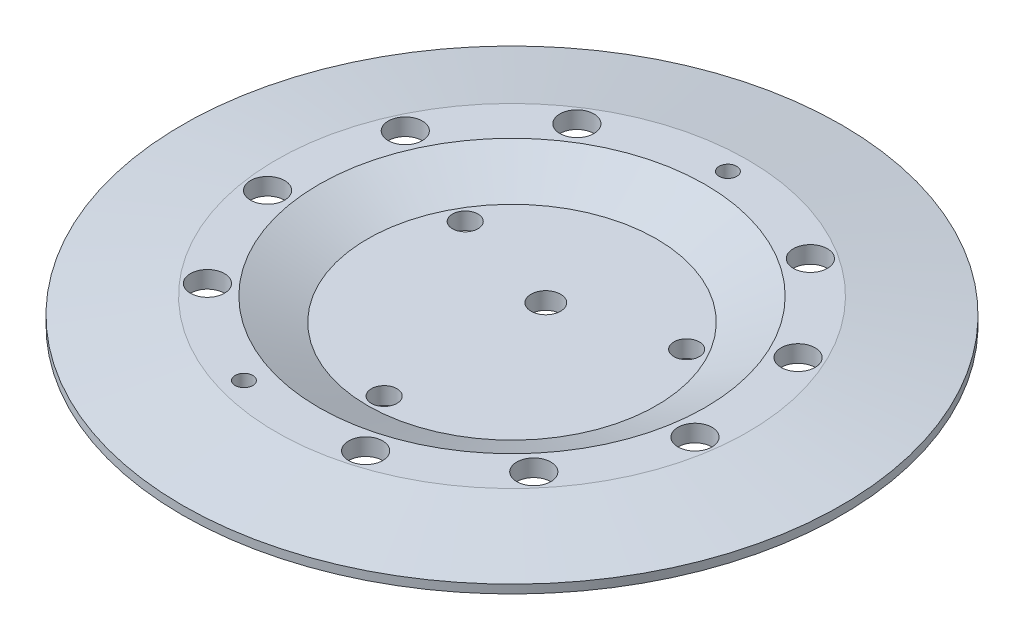
ISO-10303-21;
HEADER;
FILE_DESCRIPTION(('STEP AP214'),'2;1');
FILE_NAME('part.step','',(''),(''),'','','');
FILE_SCHEMA(('AUTOMOTIVE_DESIGN { 1 0 10303 214 1 1 1 1 }'));
ENDSEC;
DATA;
#1=APPLICATION_CONTEXT('core data for automotive mechanical design processes');
#2=APPLICATION_PROTOCOL_DEFINITION('international standard','automotive_design',2000,#1);
#3=PRODUCT_CONTEXT('',#1,'mechanical');
#4=PRODUCT('Part','Part','',(#3));
#5=PRODUCT_RELATED_PRODUCT_CATEGORY('part','',(#4));
#6=PRODUCT_DEFINITION_FORMATION('','',#4);
#7=PRODUCT_DEFINITION_CONTEXT('part definition',#1,'design');
#8=PRODUCT_DEFINITION('design','',#6,#7);
#9=PRODUCT_DEFINITION_SHAPE('','',#8);
#10=(LENGTH_UNIT() NAMED_UNIT(*) SI_UNIT(.MILLI.,.METRE.));
#11=(NAMED_UNIT(*) PLANE_ANGLE_UNIT() SI_UNIT($,.RADIAN.));
#12=(NAMED_UNIT(*) SI_UNIT($,.STERADIAN.) SOLID_ANGLE_UNIT());
#13=UNCERTAINTY_MEASURE_WITH_UNIT(LENGTH_MEASURE(1.E-05),#10,'distance_accuracy_value','');
#14=(GEOMETRIC_REPRESENTATION_CONTEXT(3) GLOBAL_UNCERTAINTY_ASSIGNED_CONTEXT((#13)) GLOBAL_UNIT_ASSIGNED_CONTEXT((#10,
#11,#12)) REPRESENTATION_CONTEXT('',''));
#15=CARTESIAN_POINT('',(0.,0.,0.));
#16=DIRECTION('',(0.,0.,1.));
#17=DIRECTION('',(1.,0.,0.));
#18=AXIS2_PLACEMENT_3D('',#15,#16,#17);
#19=CARTESIAN_POINT('',(0.,1.44153815363196,0.));
#20=DIRECTION('',(0.,1.,0.));
#21=DIRECTION('',(0.,0.,1.));
#22=AXIS2_PLACEMENT_3D('',#19,#20,#21);
#23=CONICAL_SURFACE('',#22,56.0097581554932,1.0471975511966);
#24=CARTESIAN_POINT('',(0.,2.59060481831044,0.));
#25=DIRECTION('',(0.,-1.,0.));
#26=DIRECTION('',(0.,0.,-1.));
#27=AXIS2_PLACEMENT_3D('',#24,#25,#26);
#28=CIRCLE('',#27,58.);
#29=CARTESIAN_POINT('',(0.,2.59060481831044,-58.));
#30=VERTEX_POINT('',#29);
#31=EDGE_CURVE('E142',#30,#30,#28,.T.);
#32=ORIENTED_EDGE('',*,*,#31,.T.);
#33=EDGE_LOOP('',(#32));
#34=FACE_BOUND('',#33,.T.);
#35=CARTESIAN_POINT('',(0.,1.44153815363196,0.));
#36=DIRECTION('',(0.,-1.,0.));
#37=DIRECTION('',(0.,0.,-1.));
#38=AXIS2_PLACEMENT_3D('',#35,#36,#37);
#39=CIRCLE('',#38,56.0097581554932);
#40=CARTESIAN_POINT('',(0.,1.44153815363196,-56.0097581554932));
#41=VERTEX_POINT('',#40);
#42=EDGE_CURVE('E10',#41,#41,#39,.T.);
#43=ORIENTED_EDGE('',*,*,#42,.F.);
#44=EDGE_LOOP('',(#43));
#45=FACE_BOUND('',#44,.T.);
#46=ADVANCED_FACE('F43',(#34,#45),#23,.T.);
#47=CARTESIAN_POINT('',(0.,4.,0.));
#48=DIRECTION('',(0.,-1.,0.));
#49=DIRECTION('',(0.,0.,-1.));
#50=AXIS2_PLACEMENT_3D('',#47,#48,#49);
#51=CONICAL_SURFACE('',#50,41.5,1.39626340159547);
#52=ORIENTED_EDGE('',*,*,#42,.T.);
#53=EDGE_LOOP('',(#52));
#54=FACE_BOUND('',#53,.T.);
#55=CARTESIAN_POINT('',(0.,4.,0.));
#56=DIRECTION('',(0.,-1.,0.));
#57=DIRECTION('',(0.,0.,-1.));
#58=AXIS2_PLACEMENT_3D('',#55,#56,#57);
#59=CIRCLE('',#58,41.5);
#60=CARTESIAN_POINT('',(0.,4.,-41.5));
#61=VERTEX_POINT('',#60);
#62=EDGE_CURVE('E51',#61,#61,#59,.T.);
#63=ORIENTED_EDGE('',*,*,#62,.F.);
#64=EDGE_LOOP('',(#63));
#65=FACE_BOUND('',#64,.T.);
#66=ADVANCED_FACE('F174',(#54,#65),#51,.F.);
#67=CARTESIAN_POINT('',(34.,4.,0.));
#68=DIRECTION('',(0.,-1.,0.));
#69=DIRECTION('',(0.,0.,-1.));
#70=AXIS2_PLACEMENT_3D('',#67,#68,#69);
#71=PLANE('',#70);
#72=CARTESIAN_POINT('',(10.7058371599743,4.,36.4607329973509));
#73=DIRECTION('',(0.,-1.,0.));
#74=DIRECTION('',(1.,0.,0.));
#75=AXIS2_PLACEMENT_3D('',#72,#73,#74);
#76=CIRCLE('',#75,3.);
#77=CARTESIAN_POINT('',(13.7058371599743,4.,36.4607329973509));
#78=VERTEX_POINT('',#77);
#79=EDGE_CURVE('E95',#78,#78,#76,.T.);
#80=ORIENTED_EDGE('',*,*,#79,.F.);
#81=EDGE_LOOP('',(#80));
#82=FACE_BOUND('',#81,.T.);
#83=CARTESIAN_POINT('',(-37.6132147914754,4.,5.40796385438484));
#84=DIRECTION('',(0.,-1.,0.));
#85=DIRECTION('',(1.,0.,0.));
#86=AXIS2_PLACEMENT_3D('',#83,#84,#85);
#87=CIRCLE('',#86,3.);
#88=CARTESIAN_POINT('',(-34.6132147914754,4.,5.40796385438484));
#89=VERTEX_POINT('',#88);
#90=EDGE_CURVE('E76',#89,#89,#87,.T.);
#91=ORIENTED_EDGE('',*,*,#90,.F.);
#92=EDGE_LOOP('',(#91));
#93=FACE_BOUND('',#92,.T.);
#94=CARTESIAN_POINT('',(34.5660158234717,4.,-15.7857704940717));
#95=DIRECTION('',(0.,-1.,0.));
#96=DIRECTION('',(1.,0.,0.));
#97=AXIS2_PLACEMENT_3D('',#94,#95,#96);
#98=CIRCLE('',#97,3.);
#99=CARTESIAN_POINT('',(37.5660158234717,4.,-15.7857704940717));
#100=VERTEX_POINT('',#99);
#101=EDGE_CURVE('E87',#100,#100,#98,.T.);
#102=ORIENTED_EDGE('',*,*,#101,.F.);
#103=EDGE_LOOP('',(#102));
#104=FACE_BOUND('',#103,.T.);
#105=CARTESIAN_POINT('',(20.5443510633127,4.,-31.9676342475849));
#106=DIRECTION('',(0.,-1.,0.));
#107=DIRECTION('',(1.,0.,0.));
#108=AXIS2_PLACEMENT_3D('',#105,#106,#107);
#109=CIRCLE('',#108,3.);
#110=CARTESIAN_POINT('',(23.5443510633127,4.,-31.9676342475849));
#111=VERTEX_POINT('',#110);
#112=EDGE_CURVE('E269',#111,#111,#109,.T.);
#113=ORIENTED_EDGE('',*,*,#112,.F.);
#114=EDGE_LOOP('',(#113));
#115=FACE_BOUND('',#114,.T.);
#116=CARTESIAN_POINT('',(-20.5443510633127,4.,-31.9676342475849));
#117=DIRECTION('',(0.,-1.,0.));
#118=DIRECTION('',(1.,0.,0.));
#119=AXIS2_PLACEMENT_3D('',#116,#117,#118);
#120=CIRCLE('',#119,3.);
#121=CARTESIAN_POINT('',(-17.5443510633127,4.,-31.9676342475849));
#122=VERTEX_POINT('',#121);
#123=EDGE_CURVE('E261',#122,#122,#120,.T.);
#124=ORIENTED_EDGE('',*,*,#123,.F.);
#125=EDGE_LOOP('',(#124));
#126=FACE_BOUND('',#125,.T.);
#127=CARTESIAN_POINT('',(-34.5660158234717,4.,-15.7857704940717));
#128=DIRECTION('',(0.,-1.,0.));
#129=DIRECTION('',(1.,0.,0.));
#130=AXIS2_PLACEMENT_3D('',#127,#128,#129);
#131=CIRCLE('',#130,3.);
#132=CARTESIAN_POINT('',(-31.5660158234717,4.,-15.7857704940717));
#133=VERTEX_POINT('',#132);
#134=EDGE_CURVE('E120',#133,#133,#131,.T.);
#135=ORIENTED_EDGE('',*,*,#134,.F.);
#136=EDGE_LOOP('',(#135));
#137=FACE_BOUND('',#136,.T.);
#138=CARTESIAN_POINT('',(-28.7184838254618,4.,24.8847078899208));
#139=DIRECTION('',(0.,-1.,0.));
#140=DIRECTION('',(1.,0.,0.));
#141=AXIS2_PLACEMENT_3D('',#138,#139,#140);
#142=CIRCLE('',#141,3.);
#143=CARTESIAN_POINT('',(-25.7184838254618,4.,24.8847078899208));
#144=VERTEX_POINT('',#143);
#145=EDGE_CURVE('E112',#144,#144,#142,.T.);
#146=ORIENTED_EDGE('',*,*,#145,.F.);
#147=EDGE_LOOP('',(#146));
#148=FACE_BOUND('',#147,.T.);
#149=CARTESIAN_POINT('',(37.6132147914754,4.,5.40796385438483));
#150=DIRECTION('',(0.,-1.,0.));
#151=DIRECTION('',(1.,0.,0.));
#152=AXIS2_PLACEMENT_3D('',#149,#150,#151);
#153=CIRCLE('',#152,3.);
#154=CARTESIAN_POINT('',(40.6132147914754,4.,5.40796385438483));
#155=VERTEX_POINT('',#154);
#156=EDGE_CURVE('E104',#155,#155,#153,.T.);
#157=ORIENTED_EDGE('',*,*,#156,.F.);
#158=EDGE_LOOP('',(#157));
#159=FACE_BOUND('',#158,.T.);
#160=CARTESIAN_POINT('',(28.7184838254618,4.,24.8847078899208));
#161=DIRECTION('',(0.,-1.,0.));
#162=DIRECTION('',(1.,0.,0.));
#163=AXIS2_PLACEMENT_3D('',#160,#161,#162);
#164=CIRCLE('',#163,3.);
#165=CARTESIAN_POINT('',(31.7184838254618,4.,24.8847078899208));
#166=VERTEX_POINT('',#165);
#167=EDGE_CURVE('E96',#166,#166,#164,.T.);
#168=ORIENTED_EDGE('',*,*,#167,.F.);
#169=EDGE_LOOP('',(#168));
#170=FACE_BOUND('',#169,.T.);
#171=CARTESIAN_POINT('',(0.,4.,-38.));
#172=DIRECTION('',(0.,-1.,0.));
#173=DIRECTION('',(0.,0.,-1.));
#174=AXIS2_PLACEMENT_3D('',#171,#172,#173);
#175=CIRCLE('',#174,1.55);
#176=CARTESIAN_POINT('',(0.,4.,-39.55));
#177=VERTEX_POINT('',#176);
#178=EDGE_CURVE('E138',#177,#177,#175,.T.);
#179=ORIENTED_EDGE('',*,*,#178,.F.);
#180=EDGE_LOOP('',(#179));
#181=FACE_BOUND('',#180,.T.);
#182=CARTESIAN_POINT('',(-10.7058371599743,4.,36.4607329973509));
#183=DIRECTION('',(0.,-1.,0.));
#184=DIRECTION('',(0.,0.,-1.));
#185=AXIS2_PLACEMENT_3D('',#182,#183,#184);
#186=CIRCLE('',#185,1.55);
#187=CARTESIAN_POINT('',(-10.7058371599743,4.,34.9107329973509));
#188=VERTEX_POINT('',#187);
#189=EDGE_CURVE('E129',#188,#188,#186,.T.);
#190=ORIENTED_EDGE('',*,*,#189,.F.);
#191=EDGE_LOOP('',(#190));
#192=FACE_BOUND('',#191,.T.);
#193=ORIENTED_EDGE('',*,*,#62,.T.);
#194=EDGE_LOOP('',(#193));
#195=FACE_BOUND('',#194,.T.);
#196=CARTESIAN_POINT('',(0.,4.,0.));
#197=DIRECTION('',(0.,-1.,0.));
#198=DIRECTION('',(0.,0.,-1.));
#199=AXIS2_PLACEMENT_3D('',#196,#197,#198);
#200=CIRCLE('',#199,34.);
#201=CARTESIAN_POINT('',(0.,4.,-34.));
#202=VERTEX_POINT('',#201);
#203=EDGE_CURVE('E57',#202,#202,#200,.T.);
#204=ORIENTED_EDGE('',*,*,#203,.F.);
#205=EDGE_LOOP('',(#204));
#206=FACE_BOUND('',#205,.T.);
#207=ADVANCED_FACE('F172',(#82,#93,#104,#115,#126,#137,#148,#159,#170,#181,#192,#195,#206),#71,.T.);
#208=CARTESIAN_POINT('',(0.,0.,0.));
#209=DIRECTION('',(0.,1.,0.));
#210=DIRECTION('',(0.,0.,1.));
#211=AXIS2_PLACEMENT_3D('',#208,#209,#210);
#212=CONICAL_SURFACE('',#211,25.4219723179618,1.13446401379631);
#213=ORIENTED_EDGE('',*,*,#203,.T.);
#214=EDGE_LOOP('',(#213));
#215=FACE_BOUND('',#214,.T.);
#216=CARTESIAN_POINT('',(0.,0.,0.));
#217=DIRECTION('',(0.,-1.,0.));
#218=DIRECTION('',(0.,0.,-1.));
#219=AXIS2_PLACEMENT_3D('',#216,#217,#218);
#220=CIRCLE('',#219,25.4219723179618);
#221=CARTESIAN_POINT('',(0.,0.,-25.4219723179618));
#222=VERTEX_POINT('',#221);
#223=EDGE_CURVE('E162',#222,#222,#220,.T.);
#224=ORIENTED_EDGE('',*,*,#223,.F.);
#225=EDGE_LOOP('',(#224));
#226=FACE_BOUND('',#225,.T.);
#227=ADVANCED_FACE('F169',(#215,#226),#212,.T.);
#228=CARTESIAN_POINT('',(0.,0.,0.));
#229=DIRECTION('',(0.,-1.,0.));
#230=DIRECTION('',(0.,0.,-1.));
#231=AXIS2_PLACEMENT_3D('',#228,#229,#230);
#232=PLANE('',#231);
#233=CARTESIAN_POINT('',(19.4855715851499,0.,-11.25));
#234=DIRECTION('',(0.,-1.,0.));
#235=DIRECTION('',(1.,0.,0.));
#236=AXIS2_PLACEMENT_3D('',#233,#234,#235);
#237=CIRCLE('',#236,2.25);
#238=CARTESIAN_POINT('',(21.7355715851499,0.,-11.25));
#239=VERTEX_POINT('',#238);
#240=EDGE_CURVE('E66',#239,#239,#237,.T.);
#241=ORIENTED_EDGE('',*,*,#240,.F.);
#242=EDGE_LOOP('',(#241));
#243=FACE_BOUND('',#242,.T.);
#244=CARTESIAN_POINT('',(0.,0.,-5.95));
#245=DIRECTION('',(0.,-1.,0.));
#246=DIRECTION('',(1.,0.,0.));
#247=AXIS2_PLACEMENT_3D('',#244,#245,#246);
#248=CIRCLE('',#247,2.6);
#249=CARTESIAN_POINT('',(2.6,0.,-5.95));
#250=VERTEX_POINT('',#249);
#251=EDGE_CURVE('E233',#250,#250,#248,.T.);
#252=ORIENTED_EDGE('',*,*,#251,.F.);
#253=EDGE_LOOP('',(#252));
#254=FACE_BOUND('',#253,.T.);
#255=CARTESIAN_POINT('',(0.,0.,22.5));
#256=DIRECTION('',(0.,-1.,0.));
#257=DIRECTION('',(1.,0.,0.));
#258=AXIS2_PLACEMENT_3D('',#255,#256,#257);
#259=CIRCLE('',#258,2.25);
#260=CARTESIAN_POINT('',(2.24999999999999,0.,22.5));
#261=VERTEX_POINT('',#260);
#262=EDGE_CURVE('E237',#261,#261,#259,.T.);
#263=ORIENTED_EDGE('',*,*,#262,.F.);
#264=EDGE_LOOP('',(#263));
#265=FACE_BOUND('',#264,.T.);
#266=CARTESIAN_POINT('',(-19.4855715851499,0.,-11.25));
#267=DIRECTION('',(0.,-1.,0.));
#268=DIRECTION('',(1.,0.,0.));
#269=AXIS2_PLACEMENT_3D('',#266,#267,#268);
#270=CIRCLE('',#269,2.25);
#271=CARTESIAN_POINT('',(-17.2355715851499,0.,-11.25));
#272=VERTEX_POINT('',#271);
#273=EDGE_CURVE('E241',#272,#272,#270,.T.);
#274=ORIENTED_EDGE('',*,*,#273,.F.);
#275=EDGE_LOOP('',(#274));
#276=FACE_BOUND('',#275,.T.);
#277=ORIENTED_EDGE('',*,*,#223,.T.);
#278=EDGE_LOOP('',(#277));
#279=FACE_BOUND('',#278,.T.);
#280=ADVANCED_FACE('F182',(#243,#254,#265,#276,#279),#232,.T.);
#281=CARTESIAN_POINT('',(0.,3.,0.));
#282=DIRECTION('',(0.,1.,0.));
#283=DIRECTION('',(0.,0.,1.));
#284=AXIS2_PLACEMENT_3D('',#281,#282,#283);
#285=PLANE('',#284);
#286=CARTESIAN_POINT('',(19.4855715851499,3.,-11.25));
#287=DIRECTION('',(0.,1.,0.));
#288=DIRECTION('',(0.,0.,1.));
#289=AXIS2_PLACEMENT_3D('',#286,#287,#288);
#290=CIRCLE('',#289,2.25);
#291=CARTESIAN_POINT('',(19.4855715851499,3.,-9.00000000000001));
#292=VERTEX_POINT('',#291);
#293=EDGE_CURVE('E46',#292,#292,#290,.T.);
#294=ORIENTED_EDGE('',*,*,#293,.F.);
#295=EDGE_LOOP('',(#294));
#296=FACE_BOUND('',#295,.T.);
#297=CARTESIAN_POINT('',(0.,3.,-5.95));
#298=DIRECTION('',(0.,1.,0.));
#299=DIRECTION('',(0.,0.,1.));
#300=AXIS2_PLACEMENT_3D('',#297,#298,#299);
#301=CIRCLE('',#300,2.6);
#302=CARTESIAN_POINT('',(0.,3.,-3.35));
#303=VERTEX_POINT('',#302);
#304=EDGE_CURVE('E69',#303,#303,#301,.T.);
#305=ORIENTED_EDGE('',*,*,#304,.F.);
#306=EDGE_LOOP('',(#305));
#307=FACE_BOUND('',#306,.T.);
#308=CARTESIAN_POINT('',(0.,3.,22.5));
#309=DIRECTION('',(0.,1.,0.));
#310=DIRECTION('',(0.,0.,1.));
#311=AXIS2_PLACEMENT_3D('',#308,#309,#310);
#312=CIRCLE('',#311,2.25);
#313=CARTESIAN_POINT('',(0.,3.,24.75));
#314=VERTEX_POINT('',#313);
#315=EDGE_CURVE('E65',#314,#314,#312,.T.);
#316=ORIENTED_EDGE('',*,*,#315,.F.);
#317=EDGE_LOOP('',(#316));
#318=FACE_BOUND('',#317,.T.);
#319=CARTESIAN_POINT('',(-19.4855715851499,3.,-11.25));
#320=DIRECTION('',(0.,1.,0.));
#321=DIRECTION('',(0.,0.,1.));
#322=AXIS2_PLACEMENT_3D('',#319,#320,#321);
#323=CIRCLE('',#322,2.25);
#324=CARTESIAN_POINT('',(-19.4855715851499,3.,-9.));
#325=VERTEX_POINT('',#324);
#326=EDGE_CURVE('E61',#325,#325,#323,.T.);
#327=ORIENTED_EDGE('',*,*,#326,.F.);
#328=EDGE_LOOP('',(#327));
#329=FACE_BOUND('',#328,.T.);
#330=CARTESIAN_POINT('',(0.,3.,0.));
#331=DIRECTION('',(0.,-1.,0.));
#332=DIRECTION('',(0.,0.,-1.));
#333=AXIS2_PLACEMENT_3D('',#330,#331,#332);
#334=CIRCLE('',#333,25.4219723179618);
#335=CARTESIAN_POINT('',(0.,3.,-25.4219723179618));
#336=VERTEX_POINT('',#335);
#337=EDGE_CURVE('E158',#336,#336,#334,.T.);
#338=ORIENTED_EDGE('',*,*,#337,.F.);
#339=EDGE_LOOP('',(#338));
#340=FACE_BOUND('',#339,.T.);
#341=ADVANCED_FACE('F217',(#296,#307,#318,#329,#340),#285,.T.);
#342=CARTESIAN_POINT('',(0.,6.99999999999999,0.));
#343=DIRECTION('',(0.,1.,0.));
#344=DIRECTION('',(0.,0.,1.));
#345=AXIS2_PLACEMENT_3D('',#342,#343,#344);
#346=CONICAL_SURFACE('',#345,34.,1.13446401379631);
#347=ORIENTED_EDGE('',*,*,#337,.T.);
#348=EDGE_LOOP('',(#347));
#349=FACE_BOUND('',#348,.T.);
#350=CARTESIAN_POINT('',(0.,6.99999999999999,0.));
#351=DIRECTION('',(0.,-1.,0.));
#352=DIRECTION('',(0.,0.,-1.));
#353=AXIS2_PLACEMENT_3D('',#350,#351,#352);
#354=CIRCLE('',#353,34.);
#355=CARTESIAN_POINT('',(0.,6.99999999999999,-34.));
#356=VERTEX_POINT('',#355);
#357=EDGE_CURVE('E154',#356,#356,#354,.T.);
#358=ORIENTED_EDGE('',*,*,#357,.F.);
#359=EDGE_LOOP('',(#358));
#360=FACE_BOUND('',#359,.T.);
#361=ADVANCED_FACE('F213',(#349,#360),#346,.F.);
#362=CARTESIAN_POINT('',(41.5,7.,0.));
#363=DIRECTION('',(0.,1.,0.));
#364=DIRECTION('',(0.,0.,1.));
#365=AXIS2_PLACEMENT_3D('',#362,#363,#364);
#366=PLANE('',#365);
#367=CARTESIAN_POINT('',(10.7058371599743,7.,36.4607329973509));
#368=DIRECTION('',(0.,-1.,0.));
#369=DIRECTION('',(1.,0.,0.));
#370=AXIS2_PLACEMENT_3D('',#367,#368,#369);
#371=CIRCLE('',#370,3.);
#372=CARTESIAN_POINT('',(13.7058371599743,7.,36.4607329973509));
#373=VERTEX_POINT('',#372);
#374=EDGE_CURVE('E134',#373,#373,#371,.T.);
#375=ORIENTED_EDGE('',*,*,#374,.T.);
#376=EDGE_LOOP('',(#375));
#377=FACE_BOUND('',#376,.T.);
#378=CARTESIAN_POINT('',(-37.6132147914754,7.,5.40796385438484));
#379=DIRECTION('',(0.,-1.,0.));
#380=DIRECTION('',(1.,0.,0.));
#381=AXIS2_PLACEMENT_3D('',#378,#379,#380);
#382=CIRCLE('',#381,3.);
#383=CARTESIAN_POINT('',(-34.6132147914754,7.,5.40796385438484));
#384=VERTEX_POINT('',#383);
#385=EDGE_CURVE('E81',#384,#384,#382,.T.);
#386=ORIENTED_EDGE('',*,*,#385,.T.);
#387=EDGE_LOOP('',(#386));
#388=FACE_BOUND('',#387,.T.);
#389=CARTESIAN_POINT('',(34.5660158234717,7.,-15.7857704940717));
#390=DIRECTION('',(0.,-1.,0.));
#391=DIRECTION('',(1.,0.,0.));
#392=AXIS2_PLACEMENT_3D('',#389,#390,#391);
#393=CIRCLE('',#392,3.);
#394=CARTESIAN_POINT('',(37.5660158234717,7.,-15.7857704940717));
#395=VERTEX_POINT('',#394);
#396=EDGE_CURVE('E273',#395,#395,#393,.T.);
#397=ORIENTED_EDGE('',*,*,#396,.T.);
#398=EDGE_LOOP('',(#397));
#399=FACE_BOUND('',#398,.T.);
#400=CARTESIAN_POINT('',(20.5443510633127,7.,-31.9676342475849));
#401=DIRECTION('',(0.,-1.,0.));
#402=DIRECTION('',(1.,0.,0.));
#403=AXIS2_PLACEMENT_3D('',#400,#401,#402);
#404=CIRCLE('',#403,3.);
#405=CARTESIAN_POINT('',(23.5443510633127,7.,-31.9676342475849));
#406=VERTEX_POINT('',#405);
#407=EDGE_CURVE('E265',#406,#406,#404,.T.);
#408=ORIENTED_EDGE('',*,*,#407,.T.);
#409=EDGE_LOOP('',(#408));
#410=FACE_BOUND('',#409,.T.);
#411=CARTESIAN_POINT('',(-20.5443510633127,7.,-31.9676342475849));
#412=DIRECTION('',(0.,-1.,0.));
#413=DIRECTION('',(1.,0.,0.));
#414=AXIS2_PLACEMENT_3D('',#411,#412,#413);
#415=CIRCLE('',#414,3.);
#416=CARTESIAN_POINT('',(-17.5443510633127,7.,-31.9676342475849));
#417=VERTEX_POINT('',#416);
#418=EDGE_CURVE('E124',#417,#417,#415,.T.);
#419=ORIENTED_EDGE('',*,*,#418,.T.);
#420=EDGE_LOOP('',(#419));
#421=FACE_BOUND('',#420,.T.);
#422=CARTESIAN_POINT('',(-34.5660158234717,7.,-15.7857704940717));
#423=DIRECTION('',(0.,-1.,0.));
#424=DIRECTION('',(1.,0.,0.));
#425=AXIS2_PLACEMENT_3D('',#422,#423,#424);
#426=CIRCLE('',#425,3.);
#427=CARTESIAN_POINT('',(-31.5660158234717,7.,-15.7857704940717));
#428=VERTEX_POINT('',#427);
#429=EDGE_CURVE('E116',#428,#428,#426,.T.);
#430=ORIENTED_EDGE('',*,*,#429,.T.);
#431=EDGE_LOOP('',(#430));
#432=FACE_BOUND('',#431,.T.);
#433=CARTESIAN_POINT('',(-28.7184838254618,7.,24.8847078899208));
#434=DIRECTION('',(0.,-1.,0.));
#435=DIRECTION('',(1.,0.,0.));
#436=AXIS2_PLACEMENT_3D('',#433,#434,#435);
#437=CIRCLE('',#436,3.);
#438=CARTESIAN_POINT('',(-25.7184838254618,7.,24.8847078899208));
#439=VERTEX_POINT('',#438);
#440=EDGE_CURVE('E108',#439,#439,#437,.T.);
#441=ORIENTED_EDGE('',*,*,#440,.T.);
#442=EDGE_LOOP('',(#441));
#443=FACE_BOUND('',#442,.T.);
#444=CARTESIAN_POINT('',(37.6132147914754,7.,5.40796385438483));
#445=DIRECTION('',(0.,-1.,0.));
#446=DIRECTION('',(1.,0.,0.));
#447=AXIS2_PLACEMENT_3D('',#444,#445,#446);
#448=CIRCLE('',#447,3.);
#449=CARTESIAN_POINT('',(40.6132147914754,7.,5.40796385438483));
#450=VERTEX_POINT('',#449);
#451=EDGE_CURVE('E100',#450,#450,#448,.T.);
#452=ORIENTED_EDGE('',*,*,#451,.T.);
#453=EDGE_LOOP('',(#452));
#454=FACE_BOUND('',#453,.T.);
#455=CARTESIAN_POINT('',(28.7184838254618,7.,24.8847078899208));
#456=DIRECTION('',(0.,-1.,0.));
#457=DIRECTION('',(1.,0.,0.));
#458=AXIS2_PLACEMENT_3D('',#455,#456,#457);
#459=CIRCLE('',#458,3.);
#460=CARTESIAN_POINT('',(31.7184838254618,7.,24.8847078899208));
#461=VERTEX_POINT('',#460);
#462=EDGE_CURVE('E91',#461,#461,#459,.T.);
#463=ORIENTED_EDGE('',*,*,#462,.T.);
#464=EDGE_LOOP('',(#463));
#465=FACE_BOUND('',#464,.T.);
#466=CARTESIAN_POINT('',(0.,7.,-38.));
#467=DIRECTION('',(0.,1.,0.));
#468=DIRECTION('',(0.,0.,1.));
#469=AXIS2_PLACEMENT_3D('',#466,#467,#468);
#470=CIRCLE('',#469,1.55);
#471=CARTESIAN_POINT('',(0.,7.,-36.45));
#472=VERTEX_POINT('',#471);
#473=EDGE_CURVE('E125',#472,#472,#470,.T.);
#474=ORIENTED_EDGE('',*,*,#473,.F.);
#475=EDGE_LOOP('',(#474));
#476=FACE_BOUND('',#475,.T.);
#477=CARTESIAN_POINT('',(-10.7058371599743,7.,36.4607329973509));
#478=DIRECTION('',(0.,1.,0.));
#479=DIRECTION('',(0.,0.,1.));
#480=AXIS2_PLACEMENT_3D('',#477,#478,#479);
#481=CIRCLE('',#480,1.55);
#482=CARTESIAN_POINT('',(-10.7058371599743,7.,38.0107329973509));
#483=VERTEX_POINT('',#482);
#484=EDGE_CURVE('E130',#483,#483,#481,.T.);
#485=ORIENTED_EDGE('',*,*,#484,.F.);
#486=EDGE_LOOP('',(#485));
#487=FACE_BOUND('',#486,.T.);
#488=ORIENTED_EDGE('',*,*,#357,.T.);
#489=EDGE_LOOP('',(#488));
#490=FACE_BOUND('',#489,.T.);
#491=CARTESIAN_POINT('',(0.,7.,0.));
#492=DIRECTION('',(0.,-1.,0.));
#493=DIRECTION('',(0.,0.,-1.));
#494=AXIS2_PLACEMENT_3D('',#491,#492,#493);
#495=CIRCLE('',#494,41.5);
#496=CARTESIAN_POINT('',(0.,7.,-41.5));
#497=VERTEX_POINT('',#496);
#498=EDGE_CURVE('E150',#497,#497,#495,.T.);
#499=ORIENTED_EDGE('',*,*,#498,.F.);
#500=EDGE_LOOP('',(#499));
#501=FACE_BOUND('',#500,.T.);
#502=ADVANCED_FACE('F207',(#377,#388,#399,#410,#421,#432,#443,#454,#465,#476,#487,#490,#501),
#366,.T.);
#503=CARTESIAN_POINT('',(0.,4.09060481831044,0.));
#504=DIRECTION('',(0.,-1.,0.));
#505=DIRECTION('',(0.,0.,-1.));
#506=AXIS2_PLACEMENT_3D('',#503,#504,#505);
#507=CONICAL_SURFACE('',#506,58.,1.39626340159547);
#508=ORIENTED_EDGE('',*,*,#498,.T.);
#509=EDGE_LOOP('',(#508));
#510=FACE_BOUND('',#509,.T.);
#511=CARTESIAN_POINT('',(0.,4.09060481831044,0.));
#512=DIRECTION('',(0.,-1.,0.));
#513=DIRECTION('',(0.,0.,-1.));
#514=AXIS2_PLACEMENT_3D('',#511,#512,#513);
#515=CIRCLE('',#514,58.);
#516=CARTESIAN_POINT('',(0.,4.09060481831044,-58.));
#517=VERTEX_POINT('',#516);
#518=EDGE_CURVE('E146',#517,#517,#515,.T.);
#519=ORIENTED_EDGE('',*,*,#518,.F.);
#520=EDGE_LOOP('',(#519));
#521=FACE_BOUND('',#520,.T.);
#522=ADVANCED_FACE('F197',(#510,#521),#507,.T.);
#523=CARTESIAN_POINT('',(0.,0.,0.));
#524=DIRECTION('',(0.,-1.,0.));
#525=DIRECTION('',(0.,0.,-1.));
#526=AXIS2_PLACEMENT_3D('',#523,#524,#525);
#527=CYLINDRICAL_SURFACE('',#526,58.);
#528=ORIENTED_EDGE('',*,*,#518,.T.);
#529=EDGE_LOOP('',(#528));
#530=FACE_BOUND('',#529,.T.);
#531=ORIENTED_EDGE('',*,*,#31,.F.);
#532=EDGE_LOOP('',(#531));
#533=FACE_BOUND('',#532,.T.);
#534=ADVANCED_FACE('F194',(#530,#533),#527,.T.);
#535=CARTESIAN_POINT('',(-10.7058371599743,0.,36.4607329973509));
#536=DIRECTION('',(0.,1.,0.));
#537=DIRECTION('',(0.,0.,1.));
#538=AXIS2_PLACEMENT_3D('',#535,#536,#537);
#539=CYLINDRICAL_SURFACE('',#538,1.55);
#540=ORIENTED_EDGE('',*,*,#189,.T.);
#541=EDGE_LOOP('',(#540));
#542=FACE_BOUND('',#541,.T.);
#543=ORIENTED_EDGE('',*,*,#484,.T.);
#544=EDGE_LOOP('',(#543));
#545=FACE_BOUND('',#544,.T.);
#546=ADVANCED_FACE('F196',(#542,#545),#539,.F.);
#547=CARTESIAN_POINT('',(0.,0.,-38.));
#548=DIRECTION('',(0.,1.,0.));
#549=DIRECTION('',(0.,0.,1.));
#550=AXIS2_PLACEMENT_3D('',#547,#548,#549);
#551=CYLINDRICAL_SURFACE('',#550,1.55);
#552=ORIENTED_EDGE('',*,*,#178,.T.);
#553=EDGE_LOOP('',(#552));
#554=FACE_BOUND('',#553,.T.);
#555=ORIENTED_EDGE('',*,*,#473,.T.);
#556=EDGE_LOOP('',(#555));
#557=FACE_BOUND('',#556,.T.);
#558=ADVANCED_FACE('F204',(#554,#557),#551,.F.);
#559=CARTESIAN_POINT('',(28.7184838254618,7.,24.8847078899208));
#560=DIRECTION('',(0.,-1.,0.));
#561=DIRECTION('',(1.,0.,0.));
#562=AXIS2_PLACEMENT_3D('',#559,#560,#561);
#563=CYLINDRICAL_SURFACE('',#562,3.);
#564=ORIENTED_EDGE('',*,*,#462,.F.);
#565=EDGE_LOOP('',(#564));
#566=FACE_BOUND('',#565,.T.);
#567=ORIENTED_EDGE('',*,*,#167,.T.);
#568=EDGE_LOOP('',(#567));
#569=FACE_BOUND('',#568,.T.);
#570=ADVANCED_FACE('F313',(#566,#569),#563,.F.);
#571=CARTESIAN_POINT('',(37.6132147914754,7.,5.40796385438483));
#572=DIRECTION('',(0.,-1.,0.));
#573=DIRECTION('',(1.,0.,0.));
#574=AXIS2_PLACEMENT_3D('',#571,#572,#573);
#575=CYLINDRICAL_SURFACE('',#574,3.);
#576=ORIENTED_EDGE('',*,*,#451,.F.);
#577=EDGE_LOOP('',(#576));
#578=FACE_BOUND('',#577,.T.);
#579=ORIENTED_EDGE('',*,*,#156,.T.);
#580=EDGE_LOOP('',(#579));
#581=FACE_BOUND('',#580,.T.);
#582=ADVANCED_FACE('F319',(#578,#581),#575,.F.);
#583=CARTESIAN_POINT('',(-28.7184838254618,7.,24.8847078899208));
#584=DIRECTION('',(0.,-1.,0.));
#585=DIRECTION('',(1.,0.,0.));
#586=AXIS2_PLACEMENT_3D('',#583,#584,#585);
#587=CYLINDRICAL_SURFACE('',#586,3.);
#588=ORIENTED_EDGE('',*,*,#440,.F.);
#589=EDGE_LOOP('',(#588));
#590=FACE_BOUND('',#589,.T.);
#591=ORIENTED_EDGE('',*,*,#145,.T.);
#592=EDGE_LOOP('',(#591));
#593=FACE_BOUND('',#592,.T.);
#594=ADVANCED_FACE('F327',(#590,#593),#587,.F.);
#595=CARTESIAN_POINT('',(-34.5660158234717,7.,-15.7857704940717));
#596=DIRECTION('',(0.,-1.,0.));
#597=DIRECTION('',(1.,0.,0.));
#598=AXIS2_PLACEMENT_3D('',#595,#596,#597);
#599=CYLINDRICAL_SURFACE('',#598,3.);
#600=ORIENTED_EDGE('',*,*,#429,.F.);
#601=EDGE_LOOP('',(#600));
#602=FACE_BOUND('',#601,.T.);
#603=ORIENTED_EDGE('',*,*,#134,.T.);
#604=EDGE_LOOP('',(#603));
#605=FACE_BOUND('',#604,.T.);
#606=ADVANCED_FACE('F323',(#602,#605),#599,.F.);
#607=CARTESIAN_POINT('',(-20.5443510633127,7.,-31.9676342475849));
#608=DIRECTION('',(0.,-1.,0.));
#609=DIRECTION('',(1.,0.,0.));
#610=AXIS2_PLACEMENT_3D('',#607,#608,#609);
#611=CYLINDRICAL_SURFACE('',#610,3.);
#612=ORIENTED_EDGE('',*,*,#418,.F.);
#613=EDGE_LOOP('',(#612));
#614=FACE_BOUND('',#613,.T.);
#615=ORIENTED_EDGE('',*,*,#123,.T.);
#616=EDGE_LOOP('',(#615));
#617=FACE_BOUND('',#616,.T.);
#618=ADVANCED_FACE('F326',(#614,#617),#611,.F.);
#619=CARTESIAN_POINT('',(20.5443510633127,7.,-31.9676342475849));
#620=DIRECTION('',(0.,-1.,0.));
#621=DIRECTION('',(1.,0.,0.));
#622=AXIS2_PLACEMENT_3D('',#619,#620,#621);
#623=CYLINDRICAL_SURFACE('',#622,3.);
#624=ORIENTED_EDGE('',*,*,#407,.F.);
#625=EDGE_LOOP('',(#624));
#626=FACE_BOUND('',#625,.T.);
#627=ORIENTED_EDGE('',*,*,#112,.T.);
#628=EDGE_LOOP('',(#627));
#629=FACE_BOUND('',#628,.T.);
#630=ADVANCED_FACE('F342',(#626,#629),#623,.F.);
#631=CARTESIAN_POINT('',(34.5660158234717,7.,-15.7857704940717));
#632=DIRECTION('',(0.,-1.,0.));
#633=DIRECTION('',(1.,0.,0.));
#634=AXIS2_PLACEMENT_3D('',#631,#632,#633);
#635=CYLINDRICAL_SURFACE('',#634,3.);
#636=ORIENTED_EDGE('',*,*,#396,.F.);
#637=EDGE_LOOP('',(#636));
#638=FACE_BOUND('',#637,.T.);
#639=ORIENTED_EDGE('',*,*,#101,.T.);
#640=EDGE_LOOP('',(#639));
#641=FACE_BOUND('',#640,.T.);
#642=ADVANCED_FACE('F280',(#638,#641),#635,.F.);
#643=CARTESIAN_POINT('',(-37.6132147914754,7.,5.40796385438484));
#644=DIRECTION('',(0.,-1.,0.));
#645=DIRECTION('',(1.,0.,0.));
#646=AXIS2_PLACEMENT_3D('',#643,#644,#645);
#647=CYLINDRICAL_SURFACE('',#646,3.);
#648=ORIENTED_EDGE('',*,*,#385,.F.);
#649=EDGE_LOOP('',(#648));
#650=FACE_BOUND('',#649,.T.);
#651=ORIENTED_EDGE('',*,*,#90,.T.);
#652=EDGE_LOOP('',(#651));
#653=FACE_BOUND('',#652,.T.);
#654=ADVANCED_FACE('F335',(#650,#653),#647,.F.);
#655=CARTESIAN_POINT('',(10.7058371599743,7.,36.4607329973509));
#656=DIRECTION('',(0.,-1.,0.));
#657=DIRECTION('',(1.,0.,0.));
#658=AXIS2_PLACEMENT_3D('',#655,#656,#657);
#659=CYLINDRICAL_SURFACE('',#658,3.);
#660=ORIENTED_EDGE('',*,*,#374,.F.);
#661=EDGE_LOOP('',(#660));
#662=FACE_BOUND('',#661,.T.);
#663=ORIENTED_EDGE('',*,*,#79,.T.);
#664=EDGE_LOOP('',(#663));
#665=FACE_BOUND('',#664,.T.);
#666=ADVANCED_FACE('F338',(#662,#665),#659,.F.);
#667=CARTESIAN_POINT('',(-19.4855715851499,7.,-11.25));
#668=DIRECTION('',(0.,-1.,0.));
#669=DIRECTION('',(1.,0.,0.));
#670=AXIS2_PLACEMENT_3D('',#667,#668,#669);
#671=CYLINDRICAL_SURFACE('',#670,2.25);
#672=ORIENTED_EDGE('',*,*,#326,.T.);
#673=EDGE_LOOP('',(#672));
#674=FACE_BOUND('',#673,.T.);
#675=ORIENTED_EDGE('',*,*,#273,.T.);
#676=EDGE_LOOP('',(#675));
#677=FACE_BOUND('',#676,.T.);
#678=ADVANCED_FACE('F351',(#674,#677),#671,.F.);
#679=CARTESIAN_POINT('',(0.,7.,22.5));
#680=DIRECTION('',(0.,-1.,0.));
#681=DIRECTION('',(1.,0.,0.));
#682=AXIS2_PLACEMENT_3D('',#679,#680,#681);
#683=CYLINDRICAL_SURFACE('',#682,2.25);
#684=ORIENTED_EDGE('',*,*,#315,.T.);
#685=EDGE_LOOP('',(#684));
#686=FACE_BOUND('',#685,.T.);
#687=ORIENTED_EDGE('',*,*,#262,.T.);
#688=EDGE_LOOP('',(#687));
#689=FACE_BOUND('',#688,.T.);
#690=ADVANCED_FACE('F353',(#686,#689),#683,.F.);
#691=CARTESIAN_POINT('',(0.,7.,-5.95));
#692=DIRECTION('',(0.,-1.,0.));
#693=DIRECTION('',(1.,0.,0.));
#694=AXIS2_PLACEMENT_3D('',#691,#692,#693);
#695=CYLINDRICAL_SURFACE('',#694,2.6);
#696=ORIENTED_EDGE('',*,*,#304,.T.);
#697=EDGE_LOOP('',(#696));
#698=FACE_BOUND('',#697,.T.);
#699=ORIENTED_EDGE('',*,*,#251,.T.);
#700=EDGE_LOOP('',(#699));
#701=FACE_BOUND('',#700,.T.);
#702=ADVANCED_FACE('F356',(#698,#701),#695,.F.);
#703=CARTESIAN_POINT('',(19.4855715851499,7.,-11.25));
#704=DIRECTION('',(0.,-1.,0.));
#705=DIRECTION('',(1.,0.,0.));
#706=AXIS2_PLACEMENT_3D('',#703,#704,#705);
#707=CYLINDRICAL_SURFACE('',#706,2.25);
#708=ORIENTED_EDGE('',*,*,#293,.T.);
#709=EDGE_LOOP('',(#708));
#710=FACE_BOUND('',#709,.T.);
#711=ORIENTED_EDGE('',*,*,#240,.T.);
#712=EDGE_LOOP('',(#711));
#713=FACE_BOUND('',#712,.T.);
#714=ADVANCED_FACE('F363',(#710,#713),#707,.F.);
#715=CLOSED_SHELL('',(#46,#66,#207,#227,#280,#341,#361,#502,#522,#534,#546,#558,#570,#582,#594,
#606,#618,#630,#642,#654,#666,#678,#690,#702,#714));
#716=MANIFOLD_SOLID_BREP('B2',#715);
#717=ADVANCED_BREP_SHAPE_REPRESENTATION('',(#18,#716),#14);
#718=SHAPE_DEFINITION_REPRESENTATION(#9,#717);
ENDSEC;
END-ISO-10303-21;
